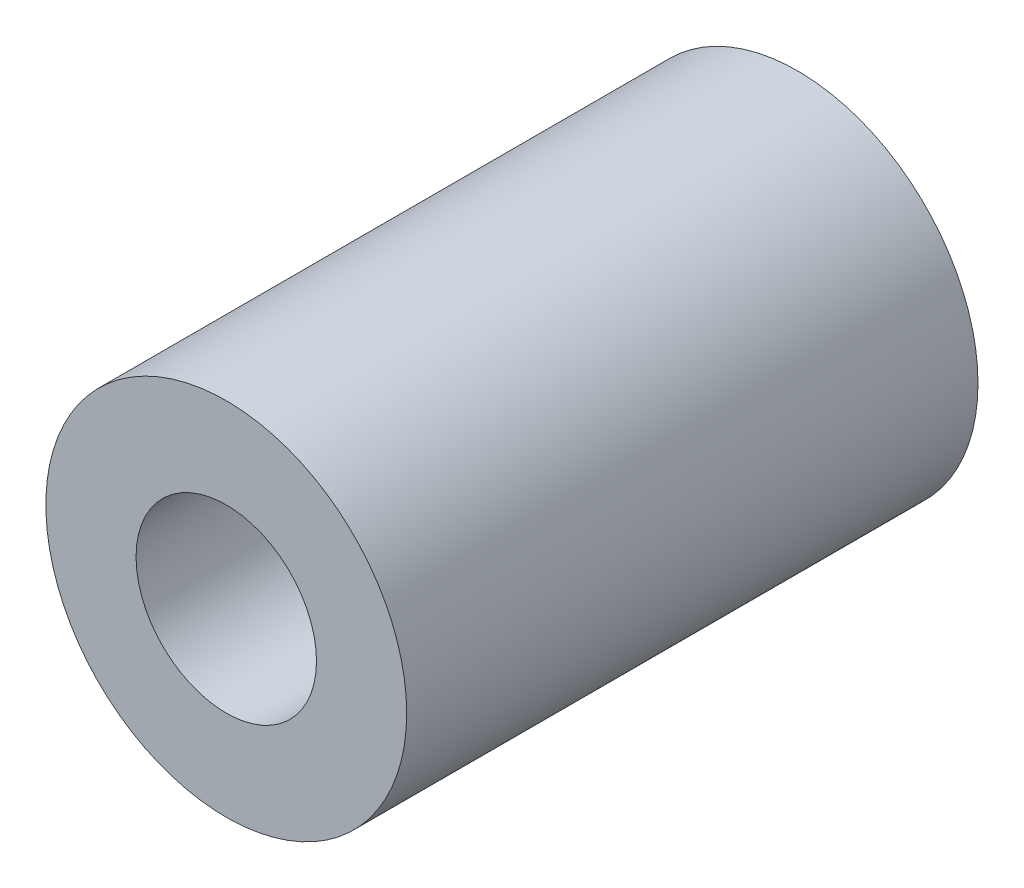
ISO-10303-21;
HEADER;
FILE_DESCRIPTION(('STEP AP214'),'2;1');
FILE_NAME('part.step','',(''),(''),'','','');
FILE_SCHEMA(('AUTOMOTIVE_DESIGN { 1 0 10303 214 1 1 1 1 }'));
ENDSEC;
DATA;
#1=APPLICATION_CONTEXT('core data for automotive mechanical design processes');
#2=APPLICATION_PROTOCOL_DEFINITION('international standard','automotive_design',2000,#1);
#3=PRODUCT_CONTEXT('',#1,'mechanical');
#4=PRODUCT('Part','Part','',(#3));
#5=PRODUCT_RELATED_PRODUCT_CATEGORY('part','',(#4));
#6=PRODUCT_DEFINITION_FORMATION('','',#4);
#7=PRODUCT_DEFINITION_CONTEXT('part definition',#1,'design');
#8=PRODUCT_DEFINITION('design','',#6,#7);
#9=PRODUCT_DEFINITION_SHAPE('','',#8);
#10=(LENGTH_UNIT() NAMED_UNIT(*) SI_UNIT(.MILLI.,.METRE.));
#11=(NAMED_UNIT(*) PLANE_ANGLE_UNIT() SI_UNIT($,.RADIAN.));
#12=(NAMED_UNIT(*) SI_UNIT($,.STERADIAN.) SOLID_ANGLE_UNIT());
#13=UNCERTAINTY_MEASURE_WITH_UNIT(LENGTH_MEASURE(1.E-05),#10,'distance_accuracy_value','');
#14=(GEOMETRIC_REPRESENTATION_CONTEXT(3) GLOBAL_UNCERTAINTY_ASSIGNED_CONTEXT((#13)) GLOBAL_UNIT_ASSIGNED_CONTEXT((#10,
#11,#12)) REPRESENTATION_CONTEXT('',''));
#15=CARTESIAN_POINT('',(0.,0.,0.));
#16=DIRECTION('',(0.,0.,1.));
#17=DIRECTION('',(1.,0.,0.));
#18=AXIS2_PLACEMENT_3D('',#15,#16,#17);
#19=CARTESIAN_POINT('',(0.,0.,9.5));
#20=DIRECTION('',(0.,0.,1.));
#21=DIRECTION('',(1.,0.,0.));
#22=AXIS2_PLACEMENT_3D('',#19,#20,#21);
#23=PLANE('',#22);
#24=CARTESIAN_POINT('',(0.,0.,9.5));
#25=DIRECTION('',(0.,0.,1.));
#26=DIRECTION('',(1.,0.,0.));
#27=AXIS2_PLACEMENT_3D('',#24,#25,#26);
#28=CIRCLE('',#27,6.);
#29=CARTESIAN_POINT('',(6.,0.,9.5));
#30=VERTEX_POINT('',#29);
#31=EDGE_CURVE('E10',#30,#30,#28,.T.);
#32=ORIENTED_EDGE('',*,*,#31,.T.);
#33=EDGE_LOOP('',(#32));
#34=FACE_BOUND('',#33,.T.);
#35=CARTESIAN_POINT('',(0.,0.,9.5));
#36=DIRECTION('',(0.,0.,1.));
#37=DIRECTION('',(1.,0.,0.));
#38=AXIS2_PLACEMENT_3D('',#35,#36,#37);
#39=CIRCLE('',#38,3.);
#40=CARTESIAN_POINT('',(3.,0.,9.5));
#41=VERTEX_POINT('',#40);
#42=EDGE_CURVE('E41',#41,#41,#39,.T.);
#43=ORIENTED_EDGE('',*,*,#42,.F.);
#44=EDGE_LOOP('',(#43));
#45=FACE_BOUND('',#44,.T.);
#46=ADVANCED_FACE('F30',(#34,#45),#23,.T.);
#47=CARTESIAN_POINT('',(0.,0.,-9.5));
#48=DIRECTION('',(0.,0.,1.));
#49=DIRECTION('',(1.,0.,0.));
#50=AXIS2_PLACEMENT_3D('',#47,#48,#49);
#51=PLANE('',#50);
#52=CARTESIAN_POINT('',(0.,0.,-9.5));
#53=DIRECTION('',(0.,0.,1.));
#54=DIRECTION('',(1.,0.,0.));
#55=AXIS2_PLACEMENT_3D('',#52,#53,#54);
#56=CIRCLE('',#55,6.);
#57=CARTESIAN_POINT('',(6.,0.,-9.5));
#58=VERTEX_POINT('',#57);
#59=EDGE_CURVE('E34',#58,#58,#56,.T.);
#60=ORIENTED_EDGE('',*,*,#59,.F.);
#61=EDGE_LOOP('',(#60));
#62=FACE_BOUND('',#61,.T.);
#63=CARTESIAN_POINT('',(0.,0.,-9.5));
#64=DIRECTION('',(0.,0.,1.));
#65=DIRECTION('',(1.,0.,0.));
#66=AXIS2_PLACEMENT_3D('',#63,#64,#65);
#67=CIRCLE('',#66,3.);
#68=CARTESIAN_POINT('',(3.,0.,-9.5));
#69=VERTEX_POINT('',#68);
#70=EDGE_CURVE('E43',#69,#69,#67,.T.);
#71=ORIENTED_EDGE('',*,*,#70,.T.);
#72=EDGE_LOOP('',(#71));
#73=FACE_BOUND('',#72,.T.);
#74=ADVANCED_FACE('F53',(#62,#73),#51,.F.);
#75=CARTESIAN_POINT('',(0.,0.,9.5));
#76=DIRECTION('',(0.,0.,-1.));
#77=DIRECTION('',(-1.,0.,0.));
#78=AXIS2_PLACEMENT_3D('',#75,#76,#77);
#79=CYLINDRICAL_SURFACE('',#78,6.);
#80=ORIENTED_EDGE('',*,*,#31,.F.);
#81=EDGE_LOOP('',(#80));
#82=FACE_BOUND('',#81,.T.);
#83=ORIENTED_EDGE('',*,*,#59,.T.);
#84=EDGE_LOOP('',(#83));
#85=FACE_BOUND('',#84,.T.);
#86=ADVANCED_FACE('F32',(#82,#85),#79,.T.);
#87=CARTESIAN_POINT('',(0.,0.,9.5));
#88=DIRECTION('',(0.,0.,-1.));
#89=DIRECTION('',(-1.,0.,0.));
#90=AXIS2_PLACEMENT_3D('',#87,#88,#89);
#91=CYLINDRICAL_SURFACE('',#90,3.);
#92=ORIENTED_EDGE('',*,*,#42,.T.);
#93=EDGE_LOOP('',(#92));
#94=FACE_BOUND('',#93,.T.);
#95=ORIENTED_EDGE('',*,*,#70,.F.);
#96=EDGE_LOOP('',(#95));
#97=FACE_BOUND('',#96,.T.);
#98=ADVANCED_FACE('F49',(#94,#97),#91,.F.);
#99=CLOSED_SHELL('',(#46,#74,#86,#98));
#100=MANIFOLD_SOLID_BREP('B2',#99);
#101=ADVANCED_BREP_SHAPE_REPRESENTATION('',(#18,#100),#14);
#102=SHAPE_DEFINITION_REPRESENTATION(#9,#101);
ENDSEC;
END-ISO-10303-21;
